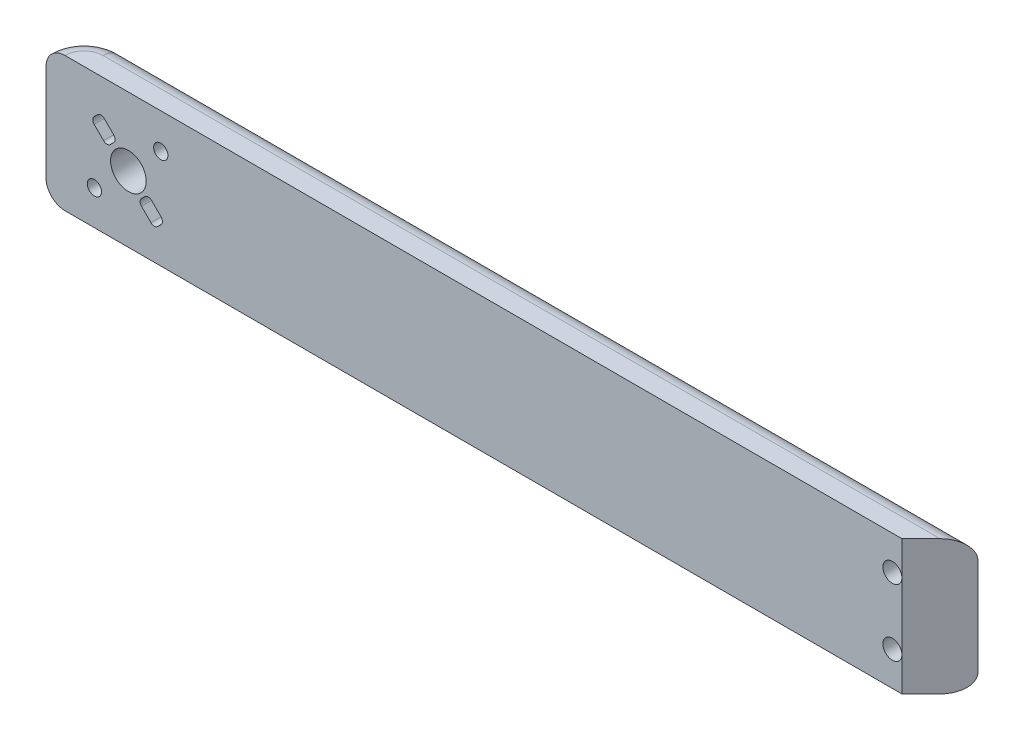
ISO-10303-21;
HEADER;
FILE_DESCRIPTION(('STEP AP214'),'2;1');
FILE_NAME('part.step','',(''),(''),'','','');
FILE_SCHEMA(('AUTOMOTIVE_DESIGN { 1 0 10303 214 1 1 1 1 }'));
ENDSEC;
DATA;
#1=APPLICATION_CONTEXT('core data for automotive mechanical design processes');
#2=APPLICATION_PROTOCOL_DEFINITION('international standard','automotive_design',2000,#1);
#3=PRODUCT_CONTEXT('',#1,'mechanical');
#4=PRODUCT('Part','Part','',(#3));
#5=PRODUCT_RELATED_PRODUCT_CATEGORY('part','',(#4));
#6=PRODUCT_DEFINITION_FORMATION('','',#4);
#7=PRODUCT_DEFINITION_CONTEXT('part definition',#1,'design');
#8=PRODUCT_DEFINITION('design','',#6,#7);
#9=PRODUCT_DEFINITION_SHAPE('','',#8);
#10=(LENGTH_UNIT() NAMED_UNIT(*) SI_UNIT(.MILLI.,.METRE.));
#11=(NAMED_UNIT(*) PLANE_ANGLE_UNIT() SI_UNIT($,.RADIAN.));
#12=(NAMED_UNIT(*) SI_UNIT($,.STERADIAN.) SOLID_ANGLE_UNIT());
#13=UNCERTAINTY_MEASURE_WITH_UNIT(LENGTH_MEASURE(1.E-05),#10,'distance_accuracy_value','');
#14=(GEOMETRIC_REPRESENTATION_CONTEXT(3) GLOBAL_UNCERTAINTY_ASSIGNED_CONTEXT((#13)) GLOBAL_UNIT_ASSIGNED_CONTEXT((#10,
#11,#12)) REPRESENTATION_CONTEXT('',''));
#15=CARTESIAN_POINT('',(0.,0.,0.));
#16=DIRECTION('',(0.,0.,1.));
#17=DIRECTION('',(1.,0.,0.));
#18=AXIS2_PLACEMENT_3D('',#15,#16,#17);
#19=CARTESIAN_POINT('',(0.,0.,8.));
#20=DIRECTION('',(0.,1.,0.));
#21=DIRECTION('',(0.,0.,1.));
#22=AXIS2_PLACEMENT_3D('',#19,#20,#21);
#23=PLANE('',#22);
#24=CARTESIAN_POINT('',(8.,0.,8.));
#25=DIRECTION('',(0.,1.,0.));
#26=DIRECTION('',(0.,0.,1.));
#27=AXIS2_PLACEMENT_3D('',#24,#25,#26);
#28=CIRCLE('',#27,4.);
#29=CARTESIAN_POINT('',(4.,0.,8.));
#30=VERTEX_POINT('',#29);
#31=CARTESIAN_POINT('',(8.,0.,4.));
#32=VERTEX_POINT('',#31);
#33=EDGE_CURVE('E442',#30,#32,#28,.F.);
#34=ORIENTED_EDGE('',*,*,#33,.T.);
#35=DIRECTION('',(1.,0.,0.));
#36=VECTOR('',#35,1.);
#37=CARTESIAN_POINT('',(188.,0.,4.));
#38=LINE('',#37,#36);
#39=CARTESIAN_POINT('',(184.,0.,4.));
#40=VERTEX_POINT('',#39);
#41=EDGE_CURVE('E210',#32,#40,#38,.T.);
#42=ORIENTED_EDGE('',*,*,#41,.T.);
#43=DIRECTION('',(0.707106781186551,0.,-0.707106781186544));
#44=VECTOR('',#43,1.);
#45=CARTESIAN_POINT('',(180.,0.,8.));
#46=LINE('',#45,#44);
#47=CARTESIAN_POINT('',(180.,0.,8.));
#48=VERTEX_POINT('',#47);
#49=EDGE_CURVE('E205',#40,#48,#46,.F.);
#50=ORIENTED_EDGE('',*,*,#49,.T.);
#51=DIRECTION('',(1.,0.,0.));
#52=VECTOR('',#51,1.);
#53=CARTESIAN_POINT('',(0.,0.,8.));
#54=LINE('',#53,#52);
#55=EDGE_CURVE('E207',#30,#48,#54,.T.);
#56=ORIENTED_EDGE('',*,*,#55,.F.);
#57=EDGE_LOOP('',(#34,#42,#50,#56));
#58=FACE_BOUND('',#57,.T.);
#59=ADVANCED_FACE('F43',(#58),#23,.F.);
#60=CARTESIAN_POINT('',(0.,28.284,8.));
#61=DIRECTION('',(0.,-1.,0.));
#62=DIRECTION('',(0.,0.,-1.));
#63=AXIS2_PLACEMENT_3D('',#60,#61,#62);
#64=PLANE('',#63);
#65=DIRECTION('',(-0.707106781186551,0.,0.707106781186544));
#66=VECTOR('',#65,1.);
#67=CARTESIAN_POINT('',(180.,28.284,8.));
#68=LINE('',#67,#66);
#69=CARTESIAN_POINT('',(180.,28.284,8.));
#70=VERTEX_POINT('',#69);
#71=CARTESIAN_POINT('',(184.,28.284,4.));
#72=VERTEX_POINT('',#71);
#73=EDGE_CURVE('E232',#70,#72,#68,.F.);
#74=ORIENTED_EDGE('',*,*,#73,.T.);
#75=DIRECTION('',(-1.,0.,0.));
#76=VECTOR('',#75,1.);
#77=CARTESIAN_POINT('',(8.,28.284,4.));
#78=LINE('',#77,#76);
#79=CARTESIAN_POINT('',(8.,28.284,4.));
#80=VERTEX_POINT('',#79);
#81=EDGE_CURVE('E423',#72,#80,#78,.T.);
#82=ORIENTED_EDGE('',*,*,#81,.T.);
#83=CARTESIAN_POINT('',(8.,28.284,8.));
#84=DIRECTION('',(0.,-1.,0.));
#85=DIRECTION('',(0.,0.,-1.));
#86=AXIS2_PLACEMENT_3D('',#83,#84,#85);
#87=CIRCLE('',#86,4.);
#88=CARTESIAN_POINT('',(4.,28.284,8.));
#89=VERTEX_POINT('',#88);
#90=EDGE_CURVE('E429',#80,#89,#87,.F.);
#91=ORIENTED_EDGE('',*,*,#90,.T.);
#92=DIRECTION('',(-1.,0.,0.));
#93=VECTOR('',#92,1.);
#94=CARTESIAN_POINT('',(0.,28.284,8.));
#95=LINE('',#94,#93);
#96=EDGE_CURVE('E223',#70,#89,#95,.T.);
#97=ORIENTED_EDGE('',*,*,#96,.F.);
#98=EDGE_LOOP('',(#74,#82,#91,#97));
#99=FACE_BOUND('',#98,.T.);
#100=ADVANCED_FACE('F334',(#99),#64,.F.);
#101=CARTESIAN_POINT('',(0.,0.,8.));
#102=DIRECTION('',(0.,0.,-1.));
#103=DIRECTION('',(-1.,0.,0.));
#104=AXIS2_PLACEMENT_3D('',#101,#102,#103);
#105=PLANE('',#104);
#106=DIRECTION('',(0.707106781186548,-0.707106781186547,0.));
#107=VECTOR('',#106,1.);
#108=CARTESIAN_POINT('',(12.8221968337489,16.1220323922277,8.));
#109=LINE('',#108,#107);
#110=CARTESIAN_POINT('',(10.1293036149354,18.8149256110412,8.));
#111=VERTEX_POINT('',#110);
#112=CARTESIAN_POINT('',(12.1150900525623,16.8291391734143,8.));
#113=VERTEX_POINT('',#112);
#114=EDGE_CURVE('E293',#111,#113,#109,.T.);
#115=ORIENTED_EDGE('',*,*,#114,.F.);
#116=CARTESIAN_POINT('',(10.836410396122,19.5220323922277,8.));
#117=DIRECTION('',(0.,0.,-1.));
#118=DIRECTION('',(-1.,0.,0.));
#119=AXIS2_PLACEMENT_3D('',#116,#117,#118);
#120=CIRCLE('',#119,1.);
#121=CARTESIAN_POINT('',(10.1293036149354,20.2291391734143,8.));
#122=VERTEX_POINT('',#121);
#123=EDGE_CURVE('E494',#111,#122,#120,.T.);
#124=ORIENTED_EDGE('',*,*,#123,.T.);
#125=DIRECTION('',(-0.707106781186548,-0.707106781186548,0.));
#126=VECTOR('',#125,1.);
#127=CARTESIAN_POINT('',(9.42219683374887,19.5220323922277,8.));
#128=LINE('',#127,#126);
#129=CARTESIAN_POINT('',(10.836410396122,20.9362459546008,8.));
#130=VERTEX_POINT('',#129);
#131=EDGE_CURVE('E277',#130,#122,#128,.T.);
#132=ORIENTED_EDGE('',*,*,#131,.F.);
#133=CARTESIAN_POINT('',(11.5435171773085,20.2291391734143,8.));
#134=DIRECTION('',(0.,0.,-1.));
#135=DIRECTION('',(-1.,0.,0.));
#136=AXIS2_PLACEMENT_3D('',#133,#134,#135);
#137=CIRCLE('',#136,1.);
#138=CARTESIAN_POINT('',(12.2506239584951,20.9362459546008,8.));
#139=VERTEX_POINT('',#138);
#140=EDGE_CURVE('E490',#130,#139,#137,.T.);
#141=ORIENTED_EDGE('',*,*,#140,.T.);
#142=DIRECTION('',(-0.707106781186539,0.707106781186556,0.));
#143=VECTOR('',#142,1.);
#144=CARTESIAN_POINT('',(11.5435171773085,21.6433527357874,8.));
#145=LINE('',#144,#143);
#146=CARTESIAN_POINT('',(14.236410396122,18.9504595169739,8.));
#147=VERTEX_POINT('',#146);
#148=EDGE_CURVE('E286',#147,#139,#145,.T.);
#149=ORIENTED_EDGE('',*,*,#148,.F.);
#150=CARTESIAN_POINT('',(13.5293036149354,18.2433527357874,8.));
#151=DIRECTION('',(0.,0.,-1.));
#152=DIRECTION('',(-1.,0.,0.));
#153=AXIS2_PLACEMENT_3D('',#150,#151,#152);
#154=CIRCLE('',#153,1.);
#155=CARTESIAN_POINT('',(14.2364103961219,17.5362459546008,8.));
#156=VERTEX_POINT('',#155);
#157=EDGE_CURVE('E482',#147,#156,#154,.T.);
#158=ORIENTED_EDGE('',*,*,#157,.T.);
#159=DIRECTION('',(0.707106781186547,0.707106781186547,0.));
#160=VECTOR('',#159,1.);
#161=CARTESIAN_POINT('',(14.9435171773085,18.2433527357874,8.));
#162=LINE('',#161,#160);
#163=CARTESIAN_POINT('',(13.5293036149354,16.8291391734143,8.));
#164=VERTEX_POINT('',#163);
#165=EDGE_CURVE('E290',#164,#156,#162,.T.);
#166=ORIENTED_EDGE('',*,*,#165,.F.);
#167=CARTESIAN_POINT('',(12.8221968337489,17.5362459546008,8.));
#168=DIRECTION('',(0.,0.,-1.));
#169=DIRECTION('',(-1.,0.,0.));
#170=AXIS2_PLACEMENT_3D('',#167,#168,#169);
#171=CIRCLE('',#170,1.);
#172=EDGE_CURVE('E486',#164,#113,#171,.T.);
#173=ORIENTED_EDGE('',*,*,#172,.T.);
#174=EDGE_LOOP('',(#115,#124,#132,#141,#149,#158,#166,#173));
#175=FACE_BOUND('',#174,.T.);
#176=DIRECTION('',(-0.707145191773733,0.707068368512756,0.));
#177=VECTOR('',#176,1.);
#178=CARTESIAN_POINT('',(24.9012088767807,8.28603042760653,8.));
#179=LINE('',#178,#177);
#180=CARTESIAN_POINT('',(24.194063685007,8.99309879611927,8.));
#181=VERTEX_POINT('',#180);
#182=CARTESIAN_POINT('',(22.2081885908439,10.9787581475998,8.));
#183=VERTEX_POINT('',#182);
#184=EDGE_CURVE('E267',#181,#183,#179,.T.);
#185=ORIENTED_EDGE('',*,*,#184,.F.);
#186=CARTESIAN_POINT('',(23.4869953164942,8.28595360434554,8.));
#187=DIRECTION('',(0.,0.,-1.));
#188=DIRECTION('',(-1.,0.,0.));
#189=AXIS2_PLACEMENT_3D('',#186,#187,#188);
#190=CIRCLE('',#189,1.);
#191=CARTESIAN_POINT('',(24.194140508268,7.57888523583279,8.));
#192=VERTEX_POINT('',#191);
#193=EDGE_CURVE('E458',#181,#192,#190,.T.);
#194=ORIENTED_EDGE('',*,*,#193,.T.);
#195=DIRECTION('',(0.707068368512746,0.707145191773743,0.));
#196=VECTOR('',#195,1.);
#197=CARTESIAN_POINT('',(22.7800037712426,6.1645948522854,8.));
#198=LINE('',#197,#196);
#199=CARTESIAN_POINT('',(23.4870721397553,6.87174004405912,8.));
#200=VERTEX_POINT('',#199);
#201=EDGE_CURVE('E270',#200,#192,#198,.T.);
#202=ORIENTED_EDGE('',*,*,#201,.F.);
#203=CARTESIAN_POINT('',(22.7799269479816,7.57880841257187,8.));
#204=DIRECTION('',(0.,0.,-1.));
#205=DIRECTION('',(-1.,0.,0.));
#206=AXIS2_PLACEMENT_3D('',#203,#204,#205);
#207=CIRCLE('',#206,1.);
#208=CARTESIAN_POINT('',(22.0728585794688,6.8716632207981,8.));
#209=VERTEX_POINT('',#208);
#210=EDGE_CURVE('E454',#200,#209,#207,.T.);
#211=ORIENTED_EDGE('',*,*,#210,.T.);
#212=DIRECTION('',(0.707145191773765,-0.707068368512724,0.));
#213=VECTOR('',#212,1.);
#214=CARTESIAN_POINT('',(19.3797614650543,9.56446776092231,8.));
#215=LINE('',#214,#213);
#216=CARTESIAN_POINT('',(20.0869450715886,8.85736098182242,8.));
#217=VERTEX_POINT('',#216);
#218=EDGE_CURVE('E260',#217,#209,#215,.T.);
#219=ORIENTED_EDGE('',*,*,#218,.F.);
#220=CARTESIAN_POINT('',(20.7940134401013,9.56450617359619,8.));
#221=DIRECTION('',(0.,0.,-1.));
#222=DIRECTION('',(-1.,0.,0.));
#223=AXIS2_PLACEMENT_3D('',#220,#221,#222);
#224=CIRCLE('',#223,1.);
#225=CARTESIAN_POINT('',(20.0869066589148,10.2716129547827,8.));
#226=VERTEX_POINT('',#225);
#227=EDGE_CURVE('E446',#217,#226,#224,.T.);
#228=ORIENTED_EDGE('',*,*,#227,.T.);
#229=DIRECTION('',(-0.707106781186546,-0.707106781186549,0.));
#230=VECTOR('',#229,1.);
#231=CARTESIAN_POINT('',(21.5010818117439,11.6857881076119,8.));
#232=LINE('',#231,#230);
#233=CARTESIAN_POINT('',(20.7940134411446,10.9787197370126,8.));
#234=VERTEX_POINT('',#233);
#235=EDGE_CURVE('E264',#234,#226,#232,.T.);
#236=ORIENTED_EDGE('',*,*,#235,.F.);
#237=CARTESIAN_POINT('',(21.5011202223312,10.2716129558261,8.));
#238=DIRECTION('',(0.,0.,-1.));
#239=DIRECTION('',(-1.,0.,0.));
#240=AXIS2_PLACEMENT_3D('',#237,#238,#239);
#241=CIRCLE('',#240,1.);
#242=EDGE_CURVE('E450',#234,#183,#241,.T.);
#243=ORIENTED_EDGE('',*,*,#242,.T.);
#244=EDGE_LOOP('',(#185,#194,#202,#211,#219,#228,#236,#243));
#245=FACE_BOUND('',#244,.T.);
#246=CARTESIAN_POINT('',(10.1804851709175,7.28151774090958,8.));
#247=DIRECTION('',(0.,0.,1.));
#248=DIRECTION('',(1.,0.,0.));
#249=AXIS2_PLACEMENT_3D('',#246,#247,#248);
#250=CIRCLE('',#249,1.5);
#251=CARTESIAN_POINT('',(11.6804851709175,7.28151774090958,8.));
#252=VERTEX_POINT('',#251);
#253=EDGE_CURVE('E315',#252,#252,#250,.T.);
#254=ORIENTED_EDGE('',*,*,#253,.F.);
#255=EDGE_LOOP('',(#254));
#256=FACE_BOUND('',#255,.T.);
#257=CARTESIAN_POINT('',(24.1428570055287,20.8833465869205,8.));
#258=DIRECTION('',(0.,0.,1.));
#259=DIRECTION('',(1.,0.,0.));
#260=AXIS2_PLACEMENT_3D('',#257,#258,#259);
#261=CIRCLE('',#260,1.5);
#262=CARTESIAN_POINT('',(25.6428570055287,20.8833465869205,8.));
#263=VERTEX_POINT('',#262);
#264=EDGE_CURVE('E308',#263,#263,#261,.T.);
#265=ORIENTED_EDGE('',*,*,#264,.F.);
#266=EDGE_LOOP('',(#265));
#267=FACE_BOUND('',#266,.T.);
#268=CARTESIAN_POINT('',(17.3230037062919,13.9183037832522,8.));
#269=DIRECTION('',(0.,0.,1.));
#270=DIRECTION('',(1.,0.,0.));
#271=AXIS2_PLACEMENT_3D('',#268,#269,#270);
#272=CIRCLE('',#271,3.75);
#273=CARTESIAN_POINT('',(21.0730037062919,13.9183037832522,8.));
#274=VERTEX_POINT('',#273);
#275=EDGE_CURVE('E254',#274,#274,#272,.T.);
#276=ORIENTED_EDGE('',*,*,#275,.F.);
#277=EDGE_LOOP('',(#276));
#278=FACE_BOUND('',#277,.T.);
#279=ORIENTED_EDGE('',*,*,#96,.T.);
#280=CARTESIAN_POINT('',(4.,24.284,8.));
#281=DIRECTION('',(0.,0.,-1.));
#282=DIRECTION('',(-1.,0.,0.));
#283=AXIS2_PLACEMENT_3D('',#280,#281,#282);
#284=CIRCLE('',#283,4.);
#285=CARTESIAN_POINT('',(0.,24.284,8.));
#286=VERTEX_POINT('',#285);
#287=EDGE_CURVE('E52',#89,#286,#284,.F.);
#288=ORIENTED_EDGE('',*,*,#287,.T.);
#289=DIRECTION('',(0.,-1.,0.));
#290=VECTOR('',#289,1.);
#291=CARTESIAN_POINT('',(0.,0.,8.));
#292=LINE('',#291,#290);
#293=CARTESIAN_POINT('',(0.,4.,8.));
#294=VERTEX_POINT('',#293);
#295=EDGE_CURVE('E224',#286,#294,#292,.T.);
#296=ORIENTED_EDGE('',*,*,#295,.T.);
#297=CARTESIAN_POINT('',(4.,4.,8.));
#298=DIRECTION('',(0.,0.,-1.));
#299=DIRECTION('',(-1.,0.,0.));
#300=AXIS2_PLACEMENT_3D('',#297,#298,#299);
#301=CIRCLE('',#300,4.);
#302=EDGE_CURVE('E222',#294,#30,#301,.F.);
#303=ORIENTED_EDGE('',*,*,#302,.T.);
#304=ORIENTED_EDGE('',*,*,#55,.T.);
#305=DIRECTION('',(0.,1.,0.));
#306=VECTOR('',#305,1.);
#307=CARTESIAN_POINT('',(180.,0.,8.));
#308=LINE('',#307,#306);
#309=CARTESIAN_POINT('',(180.,7.142,8.));
#310=VERTEX_POINT('',#309);
#311=EDGE_CURVE('E220',#48,#310,#308,.T.);
#312=ORIENTED_EDGE('',*,*,#311,.T.);
#313=CARTESIAN_POINT('',(178.,7.142,8.));
#314=DIRECTION('',(0.,0.,1.));
#315=DIRECTION('',(1.,0.,0.));
#316=AXIS2_PLACEMENT_3D('',#313,#314,#315);
#317=CIRCLE('',#316,2.);
#318=EDGE_CURVE('E250',#310,#310,#317,.T.);
#319=ORIENTED_EDGE('',*,*,#318,.F.);
#320=CARTESIAN_POINT('',(180.,21.142,8.));
#321=VERTEX_POINT('',#320);
#322=EDGE_CURVE('E231',#310,#321,#308,.T.);
#323=ORIENTED_EDGE('',*,*,#322,.T.);
#324=CARTESIAN_POINT('',(178.,21.142,8.));
#325=DIRECTION('',(0.,0.,1.));
#326=DIRECTION('',(1.,0.,0.));
#327=AXIS2_PLACEMENT_3D('',#324,#325,#326);
#328=CIRCLE('',#327,2.);
#329=EDGE_CURVE('E244',#321,#321,#328,.T.);
#330=ORIENTED_EDGE('',*,*,#329,.F.);
#331=EDGE_CURVE('E234',#321,#70,#308,.T.);
#332=ORIENTED_EDGE('',*,*,#331,.T.);
#333=EDGE_LOOP('',(#279,#288,#296,#303,#304,#312,#319,#323,#330,#332));
#334=FACE_BOUND('',#333,.T.);
#335=ADVANCED_FACE('F218',(#175,#245,#256,#267,#278,#334),#105,.F.);
#336=CARTESIAN_POINT('',(0.,0.,0.));
#337=DIRECTION('',(0.,0.,-1.));
#338=DIRECTION('',(-1.,0.,0.));
#339=AXIS2_PLACEMENT_3D('',#336,#337,#338);
#340=PLANE('',#339);
#341=DIRECTION('',(-0.707106781186539,0.707106781186556,0.));
#342=VECTOR('',#341,1.);
#343=CARTESIAN_POINT('',(11.5435171773085,21.6433527357874,0.));
#344=LINE('',#343,#342);
#345=CARTESIAN_POINT('',(14.236410396122,18.9504595169739,0.));
#346=VERTEX_POINT('',#345);
#347=CARTESIAN_POINT('',(12.2506239584951,20.9362459546008,0.));
#348=VERTEX_POINT('',#347);
#349=EDGE_CURVE('E257',#346,#348,#344,.T.);
#350=ORIENTED_EDGE('',*,*,#349,.T.);
#351=CARTESIAN_POINT('',(11.5435171773085,20.2291391734143,0.));
#352=DIRECTION('',(0.,0.,-1.));
#353=DIRECTION('',(-1.,0.,0.));
#354=AXIS2_PLACEMENT_3D('',#351,#352,#353);
#355=CIRCLE('',#354,1.);
#356=CARTESIAN_POINT('',(10.836410396122,20.9362459546008,0.));
#357=VERTEX_POINT('',#356);
#358=EDGE_CURVE('E488',#348,#357,#355,.F.);
#359=ORIENTED_EDGE('',*,*,#358,.T.);
#360=DIRECTION('',(-0.707106781186548,-0.707106781186548,0.));
#361=VECTOR('',#360,1.);
#362=CARTESIAN_POINT('',(9.42219683374887,19.5220323922277,0.));
#363=LINE('',#362,#361);
#364=CARTESIAN_POINT('',(10.1293036149354,20.2291391734143,0.));
#365=VERTEX_POINT('',#364);
#366=EDGE_CURVE('E289',#357,#365,#363,.T.);
#367=ORIENTED_EDGE('',*,*,#366,.T.);
#368=CARTESIAN_POINT('',(10.836410396122,19.5220323922277,0.));
#369=DIRECTION('',(0.,0.,-1.));
#370=DIRECTION('',(-1.,0.,0.));
#371=AXIS2_PLACEMENT_3D('',#368,#369,#370);
#372=CIRCLE('',#371,1.);
#373=CARTESIAN_POINT('',(10.1293036149354,18.8149256110412,0.));
#374=VERTEX_POINT('',#373);
#375=EDGE_CURVE('E492',#365,#374,#372,.F.);
#376=ORIENTED_EDGE('',*,*,#375,.T.);
#377=DIRECTION('',(0.707106781186548,-0.707106781186547,0.));
#378=VECTOR('',#377,1.);
#379=CARTESIAN_POINT('',(12.8221968337489,16.1220323922277,0.));
#380=LINE('',#379,#378);
#381=CARTESIAN_POINT('',(12.1150900525623,16.8291391734143,0.));
#382=VERTEX_POINT('',#381);
#383=EDGE_CURVE('E303',#374,#382,#380,.T.);
#384=ORIENTED_EDGE('',*,*,#383,.T.);
#385=CARTESIAN_POINT('',(12.8221968337489,17.5362459546008,0.));
#386=DIRECTION('',(0.,0.,-1.));
#387=DIRECTION('',(-1.,0.,0.));
#388=AXIS2_PLACEMENT_3D('',#385,#386,#387);
#389=CIRCLE('',#388,1.);
#390=CARTESIAN_POINT('',(13.5293036149354,16.8291391734143,0.));
#391=VERTEX_POINT('',#390);
#392=EDGE_CURVE('E484',#382,#391,#389,.F.);
#393=ORIENTED_EDGE('',*,*,#392,.T.);
#394=DIRECTION('',(0.707106781186547,0.707106781186547,0.));
#395=VECTOR('',#394,1.);
#396=CARTESIAN_POINT('',(14.9435171773085,18.2433527357874,0.));
#397=LINE('',#396,#395);
#398=CARTESIAN_POINT('',(14.2364103961219,17.5362459546008,0.));
#399=VERTEX_POINT('',#398);
#400=EDGE_CURVE('E300',#391,#399,#397,.T.);
#401=ORIENTED_EDGE('',*,*,#400,.T.);
#402=CARTESIAN_POINT('',(13.5293036149354,18.2433527357874,0.));
#403=DIRECTION('',(0.,0.,-1.));
#404=DIRECTION('',(-1.,0.,0.));
#405=AXIS2_PLACEMENT_3D('',#402,#403,#404);
#406=CIRCLE('',#405,1.);
#407=EDGE_CURVE('E480',#399,#346,#406,.F.);
#408=ORIENTED_EDGE('',*,*,#407,.T.);
#409=EDGE_LOOP('',(#350,#359,#367,#376,#384,#393,#401,#408));
#410=FACE_BOUND('',#409,.T.);
#411=DIRECTION('',(0.707145191773765,-0.707068368512724,0.));
#412=VECTOR('',#411,1.);
#413=CARTESIAN_POINT('',(19.3797614650543,9.56446776092231,0.));
#414=LINE('',#413,#412);
#415=CARTESIAN_POINT('',(20.0869450715886,8.85736098182242,0.));
#416=VERTEX_POINT('',#415);
#417=CARTESIAN_POINT('',(22.0728585794688,6.8716632207981,0.));
#418=VERTEX_POINT('',#417);
#419=EDGE_CURVE('E274',#416,#418,#414,.T.);
#420=ORIENTED_EDGE('',*,*,#419,.T.);
#421=CARTESIAN_POINT('',(22.7799269479816,7.57880841257187,0.));
#422=DIRECTION('',(0.,0.,-1.));
#423=DIRECTION('',(-1.,0.,0.));
#424=AXIS2_PLACEMENT_3D('',#421,#422,#423);
#425=CIRCLE('',#424,1.);
#426=CARTESIAN_POINT('',(23.4870721397553,6.87174004405912,0.));
#427=VERTEX_POINT('',#426);
#428=EDGE_CURVE('E452',#418,#427,#425,.F.);
#429=ORIENTED_EDGE('',*,*,#428,.T.);
#430=DIRECTION('',(0.707068368512746,0.707145191773743,0.));
#431=VECTOR('',#430,1.);
#432=CARTESIAN_POINT('',(22.7800037712426,6.1645948522854,0.));
#433=LINE('',#432,#431);
#434=CARTESIAN_POINT('',(24.194140508268,7.57888523583279,0.));
#435=VERTEX_POINT('',#434);
#436=EDGE_CURVE('E263',#427,#435,#433,.T.);
#437=ORIENTED_EDGE('',*,*,#436,.T.);
#438=CARTESIAN_POINT('',(23.4869953164942,8.28595360434554,0.));
#439=DIRECTION('',(0.,0.,-1.));
#440=DIRECTION('',(-1.,0.,0.));
#441=AXIS2_PLACEMENT_3D('',#438,#439,#440);
#442=CIRCLE('',#441,1.);
#443=CARTESIAN_POINT('',(24.194063685007,8.99309879611927,0.));
#444=VERTEX_POINT('',#443);
#445=EDGE_CURVE('E456',#435,#444,#442,.F.);
#446=ORIENTED_EDGE('',*,*,#445,.T.);
#447=DIRECTION('',(-0.707145191773733,0.707068368512756,0.));
#448=VECTOR('',#447,1.);
#449=CARTESIAN_POINT('',(24.9012088767807,8.28603042760653,0.));
#450=LINE('',#449,#448);
#451=CARTESIAN_POINT('',(22.2081885908439,10.9787581475998,0.));
#452=VERTEX_POINT('',#451);
#453=EDGE_CURVE('E281',#444,#452,#450,.T.);
#454=ORIENTED_EDGE('',*,*,#453,.T.);
#455=CARTESIAN_POINT('',(21.5011202223312,10.2716129558261,0.));
#456=DIRECTION('',(0.,0.,-1.));
#457=DIRECTION('',(-1.,0.,0.));
#458=AXIS2_PLACEMENT_3D('',#455,#456,#457);
#459=CIRCLE('',#458,1.);
#460=CARTESIAN_POINT('',(20.7940134411446,10.9787197370126,0.));
#461=VERTEX_POINT('',#460);
#462=EDGE_CURVE('E448',#452,#461,#459,.F.);
#463=ORIENTED_EDGE('',*,*,#462,.T.);
#464=DIRECTION('',(-0.707106781186546,-0.707106781186549,0.));
#465=VECTOR('',#464,1.);
#466=CARTESIAN_POINT('',(21.5010818117439,11.6857881076119,0.));
#467=LINE('',#466,#465);
#468=CARTESIAN_POINT('',(20.0869066589148,10.2716129547827,0.));
#469=VERTEX_POINT('',#468);
#470=EDGE_CURVE('E278',#461,#469,#467,.T.);
#471=ORIENTED_EDGE('',*,*,#470,.T.);
#472=CARTESIAN_POINT('',(20.7940134401013,9.56450617359619,0.));
#473=DIRECTION('',(0.,0.,-1.));
#474=DIRECTION('',(-1.,0.,0.));
#475=AXIS2_PLACEMENT_3D('',#472,#473,#474);
#476=CIRCLE('',#475,1.);
#477=EDGE_CURVE('E444',#469,#416,#476,.F.);
#478=ORIENTED_EDGE('',*,*,#477,.T.);
#479=EDGE_LOOP('',(#420,#429,#437,#446,#454,#463,#471,#478));
#480=FACE_BOUND('',#479,.T.);
#481=CARTESIAN_POINT('',(10.1804851709175,7.28151774090958,0.));
#482=DIRECTION('',(0.,0.,1.));
#483=DIRECTION('',(1.,0.,0.));
#484=AXIS2_PLACEMENT_3D('',#481,#482,#483);
#485=CIRCLE('',#484,1.5);
#486=CARTESIAN_POINT('',(11.6804851709175,7.28151774090958,0.));
#487=VERTEX_POINT('',#486);
#488=EDGE_CURVE('E273',#487,#487,#485,.T.);
#489=ORIENTED_EDGE('',*,*,#488,.T.);
#490=EDGE_LOOP('',(#489));
#491=FACE_BOUND('',#490,.T.);
#492=CARTESIAN_POINT('',(24.1428570055287,20.8833465869205,0.));
#493=DIRECTION('',(0.,0.,1.));
#494=DIRECTION('',(1.,0.,0.));
#495=AXIS2_PLACEMENT_3D('',#492,#493,#494);
#496=CIRCLE('',#495,1.5);
#497=CARTESIAN_POINT('',(25.6428570055287,20.8833465869205,0.));
#498=VERTEX_POINT('',#497);
#499=EDGE_CURVE('E311',#498,#498,#496,.T.);
#500=ORIENTED_EDGE('',*,*,#499,.T.);
#501=EDGE_LOOP('',(#500));
#502=FACE_BOUND('',#501,.T.);
#503=CARTESIAN_POINT('',(17.3230037062919,13.9183037832522,0.));
#504=DIRECTION('',(0.,0.,1.));
#505=DIRECTION('',(1.,0.,0.));
#506=AXIS2_PLACEMENT_3D('',#503,#504,#505);
#507=CIRCLE('',#506,3.75);
#508=CARTESIAN_POINT('',(21.0730037062919,13.9183037832522,0.));
#509=VERTEX_POINT('',#508);
#510=EDGE_CURVE('E247',#509,#509,#507,.T.);
#511=ORIENTED_EDGE('',*,*,#510,.T.);
#512=EDGE_LOOP('',(#511));
#513=FACE_BOUND('',#512,.T.);
#514=CARTESIAN_POINT('',(178.,7.142,0.));
#515=DIRECTION('',(0.,0.,1.));
#516=DIRECTION('',(1.,0.,0.));
#517=AXIS2_PLACEMENT_3D('',#514,#515,#516);
#518=CIRCLE('',#517,2.);
#519=CARTESIAN_POINT('',(180.,7.142,0.));
#520=VERTEX_POINT('',#519);
#521=EDGE_CURVE('E243',#520,#520,#518,.T.);
#522=ORIENTED_EDGE('',*,*,#521,.T.);
#523=EDGE_LOOP('',(#522));
#524=FACE_BOUND('',#523,.T.);
#525=CARTESIAN_POINT('',(178.,21.142,0.));
#526=DIRECTION('',(0.,0.,1.));
#527=DIRECTION('',(1.,0.,0.));
#528=AXIS2_PLACEMENT_3D('',#525,#526,#527);
#529=CIRCLE('',#528,2.);
#530=CARTESIAN_POINT('',(180.,21.142,0.));
#531=VERTEX_POINT('',#530);
#532=EDGE_CURVE('E246',#531,#531,#529,.T.);
#533=ORIENTED_EDGE('',*,*,#532,.T.);
#534=EDGE_LOOP('',(#533));
#535=FACE_BOUND('',#534,.T.);
#536=DIRECTION('',(0.,-1.,0.));
#537=VECTOR('',#536,1.);
#538=CARTESIAN_POINT('',(8.,28.284,0.));
#539=LINE('',#538,#537);
#540=CARTESIAN_POINT('',(8.,4.,0.));
#541=VERTEX_POINT('',#540);
#542=CARTESIAN_POINT('',(8.,24.284,0.));
#543=VERTEX_POINT('',#542);
#544=EDGE_CURVE('E214',#541,#543,#539,.F.);
#545=ORIENTED_EDGE('',*,*,#544,.T.);
#546=DIRECTION('',(-1.,0.,0.));
#547=VECTOR('',#546,1.);
#548=CARTESIAN_POINT('',(188.,24.284,0.));
#549=LINE('',#548,#547);
#550=CARTESIAN_POINT('',(188.,24.284,0.));
#551=VERTEX_POINT('',#550);
#552=EDGE_CURVE('E420',#543,#551,#549,.F.);
#553=ORIENTED_EDGE('',*,*,#552,.T.);
#554=DIRECTION('',(0.,1.,0.));
#555=VECTOR('',#554,1.);
#556=CARTESIAN_POINT('',(188.,0.,0.));
#557=LINE('',#556,#555);
#558=CARTESIAN_POINT('',(188.,4.,0.));
#559=VERTEX_POINT('',#558);
#560=EDGE_CURVE('E215',#551,#559,#557,.F.);
#561=ORIENTED_EDGE('',*,*,#560,.T.);
#562=DIRECTION('',(1.,0.,0.));
#563=VECTOR('',#562,1.);
#564=CARTESIAN_POINT('',(8.,4.,0.));
#565=LINE('',#564,#563);
#566=EDGE_CURVE('E437',#559,#541,#565,.F.);
#567=ORIENTED_EDGE('',*,*,#566,.T.);
#568=EDGE_LOOP('',(#545,#553,#561,#567));
#569=FACE_BOUND('',#568,.T.);
#570=ADVANCED_FACE('F321',(#410,#480,#491,#502,#513,#524,#535,#569),#340,.T.);
#571=CARTESIAN_POINT('',(180.,0.,8.));
#572=DIRECTION('',(-0.707106781186544,0.,-0.707106781186551));
#573=DIRECTION('',(0.,1.,0.));
#574=AXIS2_PLACEMENT_3D('',#571,#572,#573);
#575=PLANE('',#574);
#576=ORIENTED_EDGE('',*,*,#560,.F.);
#577=CARTESIAN_POINT('',(184.,24.284,4.));
#578=DIRECTION('',(-0.707106781186544,0.,-0.707106781186551));
#579=DIRECTION('',(0.707106781186551,0.,-0.707106781186544));
#580=AXIS2_PLACEMENT_3D('',#577,#578,#579);
#581=ELLIPSE('',#580,5.65685424949241,4.);
#582=EDGE_CURVE('E419',#551,#72,#581,.F.);
#583=ORIENTED_EDGE('',*,*,#582,.T.);
#584=ORIENTED_EDGE('',*,*,#73,.F.);
#585=ORIENTED_EDGE('',*,*,#331,.F.);
#586=ORIENTED_EDGE('',*,*,#322,.F.);
#587=ORIENTED_EDGE('',*,*,#311,.F.);
#588=ORIENTED_EDGE('',*,*,#49,.F.);
#589=CARTESIAN_POINT('',(184.,4.,4.));
#590=DIRECTION('',(-0.707106781186544,0.,-0.707106781186551));
#591=DIRECTION('',(-0.707106781186551,0.,0.707106781186544));
#592=AXIS2_PLACEMENT_3D('',#589,#590,#591);
#593=ELLIPSE('',#592,5.65685424949241,4.);
#594=EDGE_CURVE('E439',#40,#559,#593,.F.);
#595=ORIENTED_EDGE('',*,*,#594,.T.);
#596=EDGE_LOOP('',(#576,#583,#584,#585,#586,#587,#588,#595));
#597=FACE_BOUND('',#596,.T.);
#598=ADVANCED_FACE('F228',(#597),#575,.F.);
#599=CARTESIAN_POINT('',(178.,21.142,0.));
#600=DIRECTION('',(0.,0.,1.));
#601=DIRECTION('',(1.,0.,0.));
#602=AXIS2_PLACEMENT_3D('',#599,#600,#601);
#603=CYLINDRICAL_SURFACE('',#602,2.);
#604=ORIENTED_EDGE('',*,*,#532,.F.);
#605=EDGE_LOOP('',(#604));
#606=FACE_BOUND('',#605,.T.);
#607=ORIENTED_EDGE('',*,*,#329,.T.);
#608=EDGE_LOOP('',(#607));
#609=FACE_BOUND('',#608,.T.);
#610=ADVANCED_FACE('F367',(#606,#609),#603,.F.);
#611=CARTESIAN_POINT('',(178.,7.142,0.));
#612=DIRECTION('',(0.,0.,1.));
#613=DIRECTION('',(1.,0.,0.));
#614=AXIS2_PLACEMENT_3D('',#611,#612,#613);
#615=CYLINDRICAL_SURFACE('',#614,2.);
#616=ORIENTED_EDGE('',*,*,#521,.F.);
#617=EDGE_LOOP('',(#616));
#618=FACE_BOUND('',#617,.T.);
#619=ORIENTED_EDGE('',*,*,#318,.T.);
#620=EDGE_LOOP('',(#619));
#621=FACE_BOUND('',#620,.T.);
#622=ADVANCED_FACE('F352',(#618,#621),#615,.F.);
#623=CARTESIAN_POINT('',(8.,0.,8.));
#624=DIRECTION('',(0.,1.,0.));
#625=DIRECTION('',(0.,0.,1.));
#626=AXIS2_PLACEMENT_3D('',#623,#624,#625);
#627=CYLINDRICAL_SURFACE('',#626,8.);
#628=ORIENTED_EDGE('',*,*,#295,.F.);
#629=CARTESIAN_POINT('',(8.,24.284,8.));
#630=DIRECTION('',(0.,-1.,0.));
#631=DIRECTION('',(0.,0.,-1.));
#632=AXIS2_PLACEMENT_3D('',#629,#630,#631);
#633=CIRCLE('',#632,8.);
#634=EDGE_CURVE('E11',#286,#543,#633,.T.);
#635=ORIENTED_EDGE('',*,*,#634,.T.);
#636=ORIENTED_EDGE('',*,*,#544,.F.);
#637=CARTESIAN_POINT('',(8.,4.,8.));
#638=DIRECTION('',(0.,1.,0.));
#639=DIRECTION('',(0.,0.,1.));
#640=AXIS2_PLACEMENT_3D('',#637,#638,#639);
#641=CIRCLE('',#640,8.);
#642=EDGE_CURVE('E434',#541,#294,#641,.T.);
#643=ORIENTED_EDGE('',*,*,#642,.T.);
#644=EDGE_LOOP('',(#628,#635,#636,#643));
#645=FACE_BOUND('',#644,.T.);
#646=ADVANCED_FACE('F343',(#645),#627,.T.);
#647=CARTESIAN_POINT('',(17.3230037062919,13.9183037832522,0.));
#648=DIRECTION('',(0.,0.,1.));
#649=DIRECTION('',(1.,0.,0.));
#650=AXIS2_PLACEMENT_3D('',#647,#648,#649);
#651=CYLINDRICAL_SURFACE('',#650,3.75);
#652=ORIENTED_EDGE('',*,*,#510,.F.);
#653=EDGE_LOOP('',(#652));
#654=FACE_BOUND('',#653,.T.);
#655=ORIENTED_EDGE('',*,*,#275,.T.);
#656=EDGE_LOOP('',(#655));
#657=FACE_BOUND('',#656,.T.);
#658=ADVANCED_FACE('F341',(#654,#657),#651,.F.);
#659=CARTESIAN_POINT('',(24.1428570055287,20.8833465869205,0.));
#660=DIRECTION('',(0.,0.,1.));
#661=DIRECTION('',(1.,0.,0.));
#662=AXIS2_PLACEMENT_3D('',#659,#660,#661);
#663=CYLINDRICAL_SURFACE('',#662,1.5);
#664=ORIENTED_EDGE('',*,*,#499,.F.);
#665=EDGE_LOOP('',(#664));
#666=FACE_BOUND('',#665,.T.);
#667=ORIENTED_EDGE('',*,*,#264,.T.);
#668=EDGE_LOOP('',(#667));
#669=FACE_BOUND('',#668,.T.);
#670=ADVANCED_FACE('F328',(#666,#669),#663,.F.);
#671=CARTESIAN_POINT('',(10.1804851709175,7.28151774090958,0.));
#672=DIRECTION('',(0.,0.,1.));
#673=DIRECTION('',(1.,0.,0.));
#674=AXIS2_PLACEMENT_3D('',#671,#672,#673);
#675=CYLINDRICAL_SURFACE('',#674,1.5);
#676=ORIENTED_EDGE('',*,*,#488,.F.);
#677=EDGE_LOOP('',(#676));
#678=FACE_BOUND('',#677,.T.);
#679=ORIENTED_EDGE('',*,*,#253,.T.);
#680=EDGE_LOOP('',(#679));
#681=FACE_BOUND('',#680,.T.);
#682=ADVANCED_FACE('F324',(#678,#681),#675,.F.);
#683=CARTESIAN_POINT('',(22.7800037712426,6.1645948522854,0.));
#684=DIRECTION('',(0.707145191773743,-0.707068368512746,0.));
#685=DIRECTION('',(0.707068368512746,0.707145191773743,0.));
#686=AXIS2_PLACEMENT_3D('',#683,#684,#685);
#687=PLANE('',#686);
#688=ORIENTED_EDGE('',*,*,#201,.T.);
#689=DIRECTION('',(0.,0.,1.));
#690=VECTOR('',#689,1.);
#691=CARTESIAN_POINT('',(24.194140508268,7.57888523583279,0.));
#692=LINE('',#691,#690);
#693=EDGE_CURVE('E470',#192,#435,#692,.F.);
#694=ORIENTED_EDGE('',*,*,#693,.T.);
#695=ORIENTED_EDGE('',*,*,#436,.F.);
#696=DIRECTION('',(0.,0.,1.));
#697=VECTOR('',#696,1.);
#698=CARTESIAN_POINT('',(23.4870721397553,6.87174004405912,8.));
#699=LINE('',#698,#697);
#700=EDGE_CURVE('E472',#427,#200,#699,.T.);
#701=ORIENTED_EDGE('',*,*,#700,.T.);
#702=EDGE_LOOP('',(#688,#694,#695,#701));
#703=FACE_BOUND('',#702,.T.);
#704=ADVANCED_FACE('F327',(#703),#687,.F.);
#705=CARTESIAN_POINT('',(19.3797614650543,9.56446776092231,0.));
#706=DIRECTION('',(-0.707068368512724,-0.707145191773765,0.));
#707=DIRECTION('',(0.707145191773765,-0.707068368512724,0.));
#708=AXIS2_PLACEMENT_3D('',#705,#706,#707);
#709=PLANE('',#708);
#710=ORIENTED_EDGE('',*,*,#218,.T.);
#711=DIRECTION('',(0.,0.,1.));
#712=VECTOR('',#711,1.);
#713=CARTESIAN_POINT('',(22.0728585794688,6.8716632207981,0.));
#714=LINE('',#713,#712);
#715=EDGE_CURVE('E465',#209,#418,#714,.F.);
#716=ORIENTED_EDGE('',*,*,#715,.T.);
#717=ORIENTED_EDGE('',*,*,#419,.F.);
#718=DIRECTION('',(0.,0.,1.));
#719=VECTOR('',#718,1.);
#720=CARTESIAN_POINT('',(20.0869450715886,8.85736098182242,8.));
#721=LINE('',#720,#719);
#722=EDGE_CURVE('E467',#416,#217,#721,.T.);
#723=ORIENTED_EDGE('',*,*,#722,.T.);
#724=EDGE_LOOP('',(#710,#716,#717,#723));
#725=FACE_BOUND('',#724,.T.);
#726=ADVANCED_FACE('F565',(#725),#709,.F.);
#727=CARTESIAN_POINT('',(21.5010818117439,11.6857881076119,0.));
#728=DIRECTION('',(-0.707106781186549,0.707106781186546,0.));
#729=DIRECTION('',(-0.707106781186546,-0.707106781186549,0.));
#730=AXIS2_PLACEMENT_3D('',#727,#728,#729);
#731=PLANE('',#730);
#732=ORIENTED_EDGE('',*,*,#470,.F.);
#733=DIRECTION('',(0.,0.,1.));
#734=VECTOR('',#733,1.);
#735=CARTESIAN_POINT('',(20.7940134411446,10.9787197370126,8.));
#736=LINE('',#735,#734);
#737=EDGE_CURVE('E460',#461,#234,#736,.T.);
#738=ORIENTED_EDGE('',*,*,#737,.T.);
#739=ORIENTED_EDGE('',*,*,#235,.T.);
#740=DIRECTION('',(0.,0.,1.));
#741=VECTOR('',#740,1.);
#742=CARTESIAN_POINT('',(20.0869066589148,10.2716129547827,0.));
#743=LINE('',#742,#741);
#744=EDGE_CURVE('E463',#226,#469,#743,.F.);
#745=ORIENTED_EDGE('',*,*,#744,.T.);
#746=EDGE_LOOP('',(#732,#738,#739,#745));
#747=FACE_BOUND('',#746,.T.);
#748=ADVANCED_FACE('F563',(#747),#731,.F.);
#749=CARTESIAN_POINT('',(24.9012088767807,8.28603042760653,0.));
#750=DIRECTION('',(0.707068368512756,0.707145191773733,0.));
#751=DIRECTION('',(-0.707145191773733,0.707068368512756,0.));
#752=AXIS2_PLACEMENT_3D('',#749,#750,#751);
#753=PLANE('',#752);
#754=ORIENTED_EDGE('',*,*,#453,.F.);
#755=DIRECTION('',(0.,0.,1.));
#756=VECTOR('',#755,1.);
#757=CARTESIAN_POINT('',(24.194063685007,8.99309879611927,8.));
#758=LINE('',#757,#756);
#759=EDGE_CURVE('E475',#444,#181,#758,.T.);
#760=ORIENTED_EDGE('',*,*,#759,.T.);
#761=ORIENTED_EDGE('',*,*,#184,.T.);
#762=DIRECTION('',(0.,0.,1.));
#763=VECTOR('',#762,1.);
#764=CARTESIAN_POINT('',(22.2081885908439,10.9787581475998,0.));
#765=LINE('',#764,#763);
#766=EDGE_CURVE('E478',#183,#452,#765,.F.);
#767=ORIENTED_EDGE('',*,*,#766,.T.);
#768=EDGE_LOOP('',(#754,#760,#761,#767));
#769=FACE_BOUND('',#768,.T.);
#770=ADVANCED_FACE('F556',(#769),#753,.F.);
#771=CARTESIAN_POINT('',(9.42219683374887,19.5220323922277,0.));
#772=DIRECTION('',(-0.707106781186547,0.707106781186547,0.));
#773=DIRECTION('',(-0.707106781186548,-0.707106781186548,0.));
#774=AXIS2_PLACEMENT_3D('',#771,#772,#773);
#775=PLANE('',#774);
#776=ORIENTED_EDGE('',*,*,#131,.T.);
#777=DIRECTION('',(0.,0.,1.));
#778=VECTOR('',#777,1.);
#779=CARTESIAN_POINT('',(10.1293036149354,20.2291391734143,0.));
#780=LINE('',#779,#778);
#781=EDGE_CURVE('E506',#122,#365,#780,.F.);
#782=ORIENTED_EDGE('',*,*,#781,.T.);
#783=ORIENTED_EDGE('',*,*,#366,.F.);
#784=DIRECTION('',(0.,0.,1.));
#785=VECTOR('',#784,1.);
#786=CARTESIAN_POINT('',(10.836410396122,20.9362459546008,8.));
#787=LINE('',#786,#785);
#788=EDGE_CURVE('E508',#357,#130,#787,.T.);
#789=ORIENTED_EDGE('',*,*,#788,.T.);
#790=EDGE_LOOP('',(#776,#782,#783,#789));
#791=FACE_BOUND('',#790,.T.);
#792=ADVANCED_FACE('F574',(#791),#775,.F.);
#793=CARTESIAN_POINT('',(11.5435171773085,21.6433527357874,0.));
#794=DIRECTION('',(0.707106781186556,0.707106781186539,0.));
#795=DIRECTION('',(-0.707106781186539,0.707106781186556,0.));
#796=AXIS2_PLACEMENT_3D('',#793,#794,#795);
#797=PLANE('',#796);
#798=ORIENTED_EDGE('',*,*,#148,.T.);
#799=DIRECTION('',(0.,0.,1.));
#800=VECTOR('',#799,1.);
#801=CARTESIAN_POINT('',(12.2506239584951,20.9362459546008,0.));
#802=LINE('',#801,#800);
#803=EDGE_CURVE('E501',#139,#348,#802,.F.);
#804=ORIENTED_EDGE('',*,*,#803,.T.);
#805=ORIENTED_EDGE('',*,*,#349,.F.);
#806=DIRECTION('',(0.,0.,1.));
#807=VECTOR('',#806,1.);
#808=CARTESIAN_POINT('',(14.236410396122,18.9504595169739,8.));
#809=LINE('',#808,#807);
#810=EDGE_CURVE('E503',#346,#147,#809,.T.);
#811=ORIENTED_EDGE('',*,*,#810,.T.);
#812=EDGE_LOOP('',(#798,#804,#805,#811));
#813=FACE_BOUND('',#812,.T.);
#814=ADVANCED_FACE('F581',(#813),#797,.F.);
#815=CARTESIAN_POINT('',(14.9435171773085,18.2433527357874,0.));
#816=DIRECTION('',(0.707106781186547,-0.707106781186547,0.));
#817=DIRECTION('',(0.707106781186548,0.707106781186548,0.));
#818=AXIS2_PLACEMENT_3D('',#815,#816,#817);
#819=PLANE('',#818);
#820=ORIENTED_EDGE('',*,*,#400,.F.);
#821=DIRECTION('',(0.,0.,1.));
#822=VECTOR('',#821,1.);
#823=CARTESIAN_POINT('',(13.5293036149354,16.8291391734143,8.));
#824=LINE('',#823,#822);
#825=EDGE_CURVE('E496',#391,#164,#824,.T.);
#826=ORIENTED_EDGE('',*,*,#825,.T.);
#827=ORIENTED_EDGE('',*,*,#165,.T.);
#828=DIRECTION('',(0.,0.,1.));
#829=VECTOR('',#828,1.);
#830=CARTESIAN_POINT('',(14.2364103961219,17.5362459546008,0.));
#831=LINE('',#830,#829);
#832=EDGE_CURVE('E499',#156,#399,#831,.F.);
#833=ORIENTED_EDGE('',*,*,#832,.T.);
#834=EDGE_LOOP('',(#820,#826,#827,#833));
#835=FACE_BOUND('',#834,.T.);
#836=ADVANCED_FACE('F586',(#835),#819,.F.);
#837=CARTESIAN_POINT('',(12.8221968337489,16.1220323922277,0.));
#838=DIRECTION('',(-0.707106781186547,-0.707106781186548,0.));
#839=DIRECTION('',(0.707106781186548,-0.707106781186547,0.));
#840=AXIS2_PLACEMENT_3D('',#837,#838,#839);
#841=PLANE('',#840);
#842=ORIENTED_EDGE('',*,*,#383,.F.);
#843=DIRECTION('',(0.,0.,1.));
#844=VECTOR('',#843,1.);
#845=CARTESIAN_POINT('',(10.1293036149354,18.8149256110412,8.));
#846=LINE('',#845,#844);
#847=EDGE_CURVE('E511',#374,#111,#846,.T.);
#848=ORIENTED_EDGE('',*,*,#847,.T.);
#849=ORIENTED_EDGE('',*,*,#114,.T.);
#850=DIRECTION('',(0.,0.,1.));
#851=VECTOR('',#850,1.);
#852=CARTESIAN_POINT('',(12.1150900525623,16.8291391734143,0.));
#853=LINE('',#852,#851);
#854=EDGE_CURVE('E514',#113,#382,#853,.F.);
#855=ORIENTED_EDGE('',*,*,#854,.T.);
#856=EDGE_LOOP('',(#842,#848,#849,#855));
#857=FACE_BOUND('',#856,.T.);
#858=ADVANCED_FACE('F373',(#857),#841,.F.);
#859=CARTESIAN_POINT('',(10.836410396122,19.5220323922277,0.));
#860=DIRECTION('',(0.,0.,-1.));
#861=DIRECTION('',(-1.,0.,0.));
#862=AXIS2_PLACEMENT_3D('',#859,#860,#861);
#863=CYLINDRICAL_SURFACE('',#862,1.);
#864=ORIENTED_EDGE('',*,*,#375,.F.);
#865=ORIENTED_EDGE('',*,*,#781,.F.);
#866=ORIENTED_EDGE('',*,*,#123,.F.);
#867=ORIENTED_EDGE('',*,*,#847,.F.);
#868=EDGE_LOOP('',(#864,#865,#866,#867));
#869=FACE_BOUND('',#868,.T.);
#870=ADVANCED_FACE('F369',(#869),#863,.F.);
#871=CARTESIAN_POINT('',(11.5435171773085,20.2291391734143,0.));
#872=DIRECTION('',(0.,0.,-1.));
#873=DIRECTION('',(-1.,0.,0.));
#874=AXIS2_PLACEMENT_3D('',#871,#872,#873);
#875=CYLINDRICAL_SURFACE('',#874,1.);
#876=ORIENTED_EDGE('',*,*,#358,.F.);
#877=ORIENTED_EDGE('',*,*,#803,.F.);
#878=ORIENTED_EDGE('',*,*,#140,.F.);
#879=ORIENTED_EDGE('',*,*,#788,.F.);
#880=EDGE_LOOP('',(#876,#877,#878,#879));
#881=FACE_BOUND('',#880,.T.);
#882=ADVANCED_FACE('F372',(#881),#875,.F.);
#883=CARTESIAN_POINT('',(12.8221968337489,17.5362459546008,0.));
#884=DIRECTION('',(0.,0.,-1.));
#885=DIRECTION('',(-1.,0.,0.));
#886=AXIS2_PLACEMENT_3D('',#883,#884,#885);
#887=CYLINDRICAL_SURFACE('',#886,1.);
#888=ORIENTED_EDGE('',*,*,#392,.F.);
#889=ORIENTED_EDGE('',*,*,#854,.F.);
#890=ORIENTED_EDGE('',*,*,#172,.F.);
#891=ORIENTED_EDGE('',*,*,#825,.F.);
#892=EDGE_LOOP('',(#888,#889,#890,#891));
#893=FACE_BOUND('',#892,.T.);
#894=ADVANCED_FACE('F377',(#893),#887,.F.);
#895=CARTESIAN_POINT('',(13.5293036149354,18.2433527357874,0.));
#896=DIRECTION('',(0.,0.,-1.));
#897=DIRECTION('',(-1.,0.,0.));
#898=AXIS2_PLACEMENT_3D('',#895,#896,#897);
#899=CYLINDRICAL_SURFACE('',#898,1.);
#900=ORIENTED_EDGE('',*,*,#407,.F.);
#901=ORIENTED_EDGE('',*,*,#832,.F.);
#902=ORIENTED_EDGE('',*,*,#157,.F.);
#903=ORIENTED_EDGE('',*,*,#810,.F.);
#904=EDGE_LOOP('',(#900,#901,#902,#903));
#905=FACE_BOUND('',#904,.T.);
#906=ADVANCED_FACE('F381',(#905),#899,.F.);
#907=CARTESIAN_POINT('',(23.4869953164942,8.28595360434554,0.));
#908=DIRECTION('',(0.,0.,-1.));
#909=DIRECTION('',(-1.,0.,0.));
#910=AXIS2_PLACEMENT_3D('',#907,#908,#909);
#911=CYLINDRICAL_SURFACE('',#910,1.);
#912=ORIENTED_EDGE('',*,*,#445,.F.);
#913=ORIENTED_EDGE('',*,*,#693,.F.);
#914=ORIENTED_EDGE('',*,*,#193,.F.);
#915=ORIENTED_EDGE('',*,*,#759,.F.);
#916=EDGE_LOOP('',(#912,#913,#914,#915));
#917=FACE_BOUND('',#916,.T.);
#918=ADVANCED_FACE('F385',(#917),#911,.F.);
#919=CARTESIAN_POINT('',(22.7799269479816,7.57880841257187,0.));
#920=DIRECTION('',(0.,0.,-1.));
#921=DIRECTION('',(-1.,0.,0.));
#922=AXIS2_PLACEMENT_3D('',#919,#920,#921);
#923=CYLINDRICAL_SURFACE('',#922,1.);
#924=ORIENTED_EDGE('',*,*,#428,.F.);
#925=ORIENTED_EDGE('',*,*,#715,.F.);
#926=ORIENTED_EDGE('',*,*,#210,.F.);
#927=ORIENTED_EDGE('',*,*,#700,.F.);
#928=EDGE_LOOP('',(#924,#925,#926,#927));
#929=FACE_BOUND('',#928,.T.);
#930=ADVANCED_FACE('F389',(#929),#923,.F.);
#931=CARTESIAN_POINT('',(21.5011202223312,10.2716129558261,0.));
#932=DIRECTION('',(0.,0.,-1.));
#933=DIRECTION('',(-1.,0.,0.));
#934=AXIS2_PLACEMENT_3D('',#931,#932,#933);
#935=CYLINDRICAL_SURFACE('',#934,1.);
#936=ORIENTED_EDGE('',*,*,#462,.F.);
#937=ORIENTED_EDGE('',*,*,#766,.F.);
#938=ORIENTED_EDGE('',*,*,#242,.F.);
#939=ORIENTED_EDGE('',*,*,#737,.F.);
#940=EDGE_LOOP('',(#936,#937,#938,#939));
#941=FACE_BOUND('',#940,.T.);
#942=ADVANCED_FACE('F393',(#941),#935,.F.);
#943=CARTESIAN_POINT('',(20.7940134401013,9.56450617359619,0.));
#944=DIRECTION('',(0.,0.,-1.));
#945=DIRECTION('',(-1.,0.,0.));
#946=AXIS2_PLACEMENT_3D('',#943,#944,#945);
#947=CYLINDRICAL_SURFACE('',#946,1.);
#948=ORIENTED_EDGE('',*,*,#477,.F.);
#949=ORIENTED_EDGE('',*,*,#744,.F.);
#950=ORIENTED_EDGE('',*,*,#227,.F.);
#951=ORIENTED_EDGE('',*,*,#722,.F.);
#952=EDGE_LOOP('',(#948,#949,#950,#951));
#953=FACE_BOUND('',#952,.T.);
#954=ADVANCED_FACE('F397',(#953),#947,.F.);
#955=CARTESIAN_POINT('',(8.,4.,8.));
#956=DIRECTION('',(0.,1.,0.));
#957=DIRECTION('',(0.,0.,1.));
#958=AXIS2_PLACEMENT_3D('',#955,#956,#957);
#959=DEGENERATE_TOROIDAL_SURFACE('',#958,4.,4.,.T.);
#960=ORIENTED_EDGE('',*,*,#302,.F.);
#961=ORIENTED_EDGE('',*,*,#642,.F.);
#962=CARTESIAN_POINT('',(8.,4.,4.));
#963=DIRECTION('',(1.,0.,0.));
#964=DIRECTION('',(0.,0.,-1.));
#965=AXIS2_PLACEMENT_3D('',#962,#963,#964);
#966=CIRCLE('',#965,4.);
#967=EDGE_CURVE('E312',#32,#541,#966,.T.);
#968=ORIENTED_EDGE('',*,*,#967,.F.);
#969=ORIENTED_EDGE('',*,*,#33,.F.);
#970=EDGE_LOOP('',(#960,#961,#968,#969));
#971=FACE_BOUND('',#970,.T.);
#972=ADVANCED_FACE('F401',(#971),#959,.T.);
#973=CARTESIAN_POINT('',(0.,4.,4.));
#974=DIRECTION('',(-1.,0.,0.));
#975=DIRECTION('',(0.,0.,1.));
#976=AXIS2_PLACEMENT_3D('',#973,#974,#975);
#977=CYLINDRICAL_SURFACE('',#976,4.);
#978=ORIENTED_EDGE('',*,*,#967,.T.);
#979=ORIENTED_EDGE('',*,*,#566,.F.);
#980=ORIENTED_EDGE('',*,*,#594,.F.);
#981=ORIENTED_EDGE('',*,*,#41,.F.);
#982=EDGE_LOOP('',(#978,#979,#980,#981));
#983=FACE_BOUND('',#982,.T.);
#984=ADVANCED_FACE('F403',(#983),#977,.T.);
#985=CARTESIAN_POINT('',(8.,24.284,8.));
#986=DIRECTION('',(0.,-1.,0.));
#987=DIRECTION('',(0.,0.,-1.));
#988=AXIS2_PLACEMENT_3D('',#985,#986,#987);
#989=DEGENERATE_TOROIDAL_SURFACE('',#988,4.,4.,.T.);
#990=ORIENTED_EDGE('',*,*,#287,.F.);
#991=ORIENTED_EDGE('',*,*,#90,.F.);
#992=CARTESIAN_POINT('',(8.,24.284,4.));
#993=DIRECTION('',(1.,0.,0.));
#994=DIRECTION('',(0.,0.,-1.));
#995=AXIS2_PLACEMENT_3D('',#992,#993,#994);
#996=CIRCLE('',#995,4.);
#997=EDGE_CURVE('E47',#543,#80,#996,.T.);
#998=ORIENTED_EDGE('',*,*,#997,.F.);
#999=ORIENTED_EDGE('',*,*,#634,.F.);
#1000=EDGE_LOOP('',(#990,#991,#998,#999));
#1001=FACE_BOUND('',#1000,.T.);
#1002=ADVANCED_FACE('F45',(#1001),#989,.T.);
#1003=CARTESIAN_POINT('',(0.,24.284,4.));
#1004=DIRECTION('',(1.,0.,0.));
#1005=DIRECTION('',(0.,0.,-1.));
#1006=AXIS2_PLACEMENT_3D('',#1003,#1004,#1005);
#1007=CYLINDRICAL_SURFACE('',#1006,4.);
#1008=ORIENTED_EDGE('',*,*,#582,.F.);
#1009=ORIENTED_EDGE('',*,*,#552,.F.);
#1010=ORIENTED_EDGE('',*,*,#997,.T.);
#1011=ORIENTED_EDGE('',*,*,#81,.F.);
#1012=EDGE_LOOP('',(#1008,#1009,#1010,#1011));
#1013=FACE_BOUND('',#1012,.T.);
#1014=ADVANCED_FACE('F409',(#1013),#1007,.T.);
#1015=CLOSED_SHELL('',(#59,#100,#335,#570,#598,#610,#622,#646,#658,#670,#682,#704,#726,#748,
#770,#792,#814,#836,#858,#870,#882,#894,#906,#918,#930,#942,#954,#972,#984,#1002,#1014));
#1016=MANIFOLD_SOLID_BREP('B2',#1015);
#1017=ADVANCED_BREP_SHAPE_REPRESENTATION('',(#18,#1016),#14);
#1018=SHAPE_DEFINITION_REPRESENTATION(#9,#1017);
ENDSEC;
END-ISO-10303-21;
